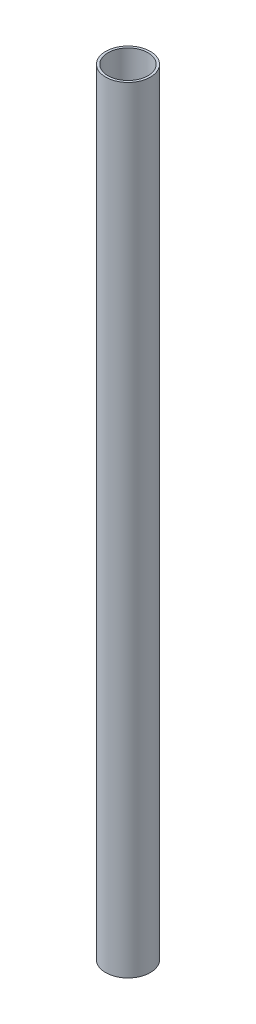
ISO-10303-21;
HEADER;
FILE_DESCRIPTION(('STEP AP214'),'2;1');
FILE_NAME('part.step','',(''),(''),'','','');
FILE_SCHEMA(('AUTOMOTIVE_DESIGN { 1 0 10303 214 1 1 1 1 }'));
ENDSEC;
DATA;
#1=APPLICATION_CONTEXT('core data for automotive mechanical design processes');
#2=APPLICATION_PROTOCOL_DEFINITION('international standard','automotive_design',2000,#1);
#3=PRODUCT_CONTEXT('',#1,'mechanical');
#4=PRODUCT('Part','Part','',(#3));
#5=PRODUCT_RELATED_PRODUCT_CATEGORY('part','',(#4));
#6=PRODUCT_DEFINITION_FORMATION('','',#4);
#7=PRODUCT_DEFINITION_CONTEXT('part definition',#1,'design');
#8=PRODUCT_DEFINITION('design','',#6,#7);
#9=PRODUCT_DEFINITION_SHAPE('','',#8);
#10=(LENGTH_UNIT() NAMED_UNIT(*) SI_UNIT(.MILLI.,.METRE.));
#11=(NAMED_UNIT(*) PLANE_ANGLE_UNIT() SI_UNIT($,.RADIAN.));
#12=(NAMED_UNIT(*) SI_UNIT($,.STERADIAN.) SOLID_ANGLE_UNIT());
#13=UNCERTAINTY_MEASURE_WITH_UNIT(LENGTH_MEASURE(1.E-05),#10,'distance_accuracy_value','');
#14=(GEOMETRIC_REPRESENTATION_CONTEXT(3) GLOBAL_UNCERTAINTY_ASSIGNED_CONTEXT((#13)) GLOBAL_UNIT_ASSIGNED_CONTEXT((#10,
#11,#12)) REPRESENTATION_CONTEXT('',''));
#15=CARTESIAN_POINT('',(0.,0.,0.));
#16=DIRECTION('',(0.,0.,1.));
#17=DIRECTION('',(1.,0.,0.));
#18=AXIS2_PLACEMENT_3D('',#15,#16,#17);
#19=CARTESIAN_POINT('',(0.,330.,0.));
#20=DIRECTION('',(0.,1.,0.));
#21=DIRECTION('',(0.,0.,1.));
#22=AXIS2_PLACEMENT_3D('',#19,#20,#21);
#23=PLANE('',#22);
#24=CARTESIAN_POINT('',(0.,330.,0.));
#25=DIRECTION('',(0.,1.,0.));
#26=DIRECTION('',(0.,0.,1.));
#27=AXIS2_PLACEMENT_3D('',#24,#25,#26);
#28=CIRCLE('',#27,9.5);
#29=CARTESIAN_POINT('',(0.,330.,9.5));
#30=VERTEX_POINT('',#29);
#31=EDGE_CURVE('E10',#30,#30,#28,.T.);
#32=ORIENTED_EDGE('',*,*,#31,.T.);
#33=EDGE_LOOP('',(#32));
#34=FACE_BOUND('',#33,.T.);
#35=CARTESIAN_POINT('',(0.,330.,0.));
#36=DIRECTION('',(0.,1.,0.));
#37=DIRECTION('',(0.,0.,1.));
#38=AXIS2_PLACEMENT_3D('',#35,#36,#37);
#39=CIRCLE('',#38,8.5);
#40=CARTESIAN_POINT('',(0.,330.,8.5));
#41=VERTEX_POINT('',#40);
#42=EDGE_CURVE('E42',#41,#41,#39,.T.);
#43=ORIENTED_EDGE('',*,*,#42,.F.);
#44=EDGE_LOOP('',(#43));
#45=FACE_BOUND('',#44,.T.);
#46=ADVANCED_FACE('F31',(#34,#45),#23,.T.);
#47=CARTESIAN_POINT('',(0.,0.,0.));
#48=DIRECTION('',(0.,1.,0.));
#49=DIRECTION('',(0.,0.,1.));
#50=AXIS2_PLACEMENT_3D('',#47,#48,#49);
#51=PLANE('',#50);
#52=CARTESIAN_POINT('',(0.,0.,0.));
#53=DIRECTION('',(0.,1.,0.));
#54=DIRECTION('',(0.,0.,1.));
#55=AXIS2_PLACEMENT_3D('',#52,#53,#54);
#56=CIRCLE('',#55,9.5);
#57=CARTESIAN_POINT('',(0.,0.,9.5));
#58=VERTEX_POINT('',#57);
#59=EDGE_CURVE('E35',#58,#58,#56,.T.);
#60=ORIENTED_EDGE('',*,*,#59,.F.);
#61=EDGE_LOOP('',(#60));
#62=FACE_BOUND('',#61,.T.);
#63=CARTESIAN_POINT('',(0.,0.,0.));
#64=DIRECTION('',(0.,1.,0.));
#65=DIRECTION('',(0.,0.,1.));
#66=AXIS2_PLACEMENT_3D('',#63,#64,#65);
#67=CIRCLE('',#66,8.5);
#68=CARTESIAN_POINT('',(0.,0.,8.5));
#69=VERTEX_POINT('',#68);
#70=EDGE_CURVE('E44',#69,#69,#67,.T.);
#71=ORIENTED_EDGE('',*,*,#70,.T.);
#72=EDGE_LOOP('',(#71));
#73=FACE_BOUND('',#72,.T.);
#74=ADVANCED_FACE('F54',(#62,#73),#51,.F.);
#75=CARTESIAN_POINT('',(0.,330.,0.));
#76=DIRECTION('',(0.,-1.,0.));
#77=DIRECTION('',(0.,0.,-1.));
#78=AXIS2_PLACEMENT_3D('',#75,#76,#77);
#79=CYLINDRICAL_SURFACE('',#78,9.5);
#80=ORIENTED_EDGE('',*,*,#31,.F.);
#81=EDGE_LOOP('',(#80));
#82=FACE_BOUND('',#81,.T.);
#83=ORIENTED_EDGE('',*,*,#59,.T.);
#84=EDGE_LOOP('',(#83));
#85=FACE_BOUND('',#84,.T.);
#86=ADVANCED_FACE('F33',(#82,#85),#79,.T.);
#87=CARTESIAN_POINT('',(0.,330.,0.));
#88=DIRECTION('',(0.,-1.,0.));
#89=DIRECTION('',(0.,0.,-1.));
#90=AXIS2_PLACEMENT_3D('',#87,#88,#89);
#91=CYLINDRICAL_SURFACE('',#90,8.5);
#92=ORIENTED_EDGE('',*,*,#42,.T.);
#93=EDGE_LOOP('',(#92));
#94=FACE_BOUND('',#93,.T.);
#95=ORIENTED_EDGE('',*,*,#70,.F.);
#96=EDGE_LOOP('',(#95));
#97=FACE_BOUND('',#96,.T.);
#98=ADVANCED_FACE('F50',(#94,#97),#91,.F.);
#99=CLOSED_SHELL('',(#46,#74,#86,#98));
#100=MANIFOLD_SOLID_BREP('B2',#99);
#101=ADVANCED_BREP_SHAPE_REPRESENTATION('',(#18,#100),#14);
#102=SHAPE_DEFINITION_REPRESENTATION(#9,#101);
ENDSEC;
END-ISO-10303-21;
